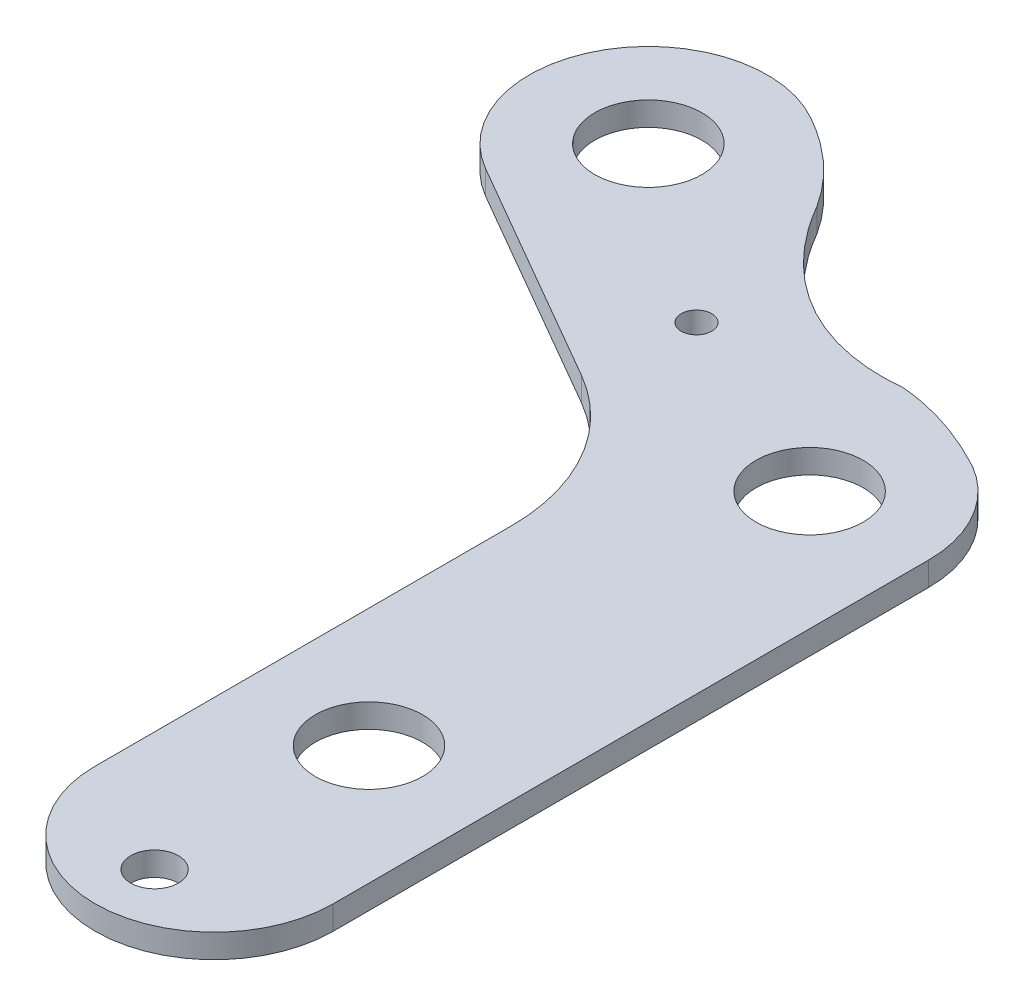
ISO-10303-21;
HEADER;
FILE_DESCRIPTION(('STEP AP214'),'2;1');
FILE_NAME('part.step','',(''),(''),'','','');
FILE_SCHEMA(('AUTOMOTIVE_DESIGN { 1 0 10303 214 1 1 1 1 }'));
ENDSEC;
DATA;
#1=APPLICATION_CONTEXT('core data for automotive mechanical design processes');
#2=APPLICATION_PROTOCOL_DEFINITION('international standard','automotive_design',2000,#1);
#3=PRODUCT_CONTEXT('',#1,'mechanical');
#4=PRODUCT('Part','Part','',(#3));
#5=PRODUCT_RELATED_PRODUCT_CATEGORY('part','',(#4));
#6=PRODUCT_DEFINITION_FORMATION('','',#4);
#7=PRODUCT_DEFINITION_CONTEXT('part definition',#1,'design');
#8=PRODUCT_DEFINITION('design','',#6,#7);
#9=PRODUCT_DEFINITION_SHAPE('','',#8);
#10=(LENGTH_UNIT() NAMED_UNIT(*) SI_UNIT(.MILLI.,.METRE.));
#11=(NAMED_UNIT(*) PLANE_ANGLE_UNIT() SI_UNIT($,.RADIAN.));
#12=(NAMED_UNIT(*) SI_UNIT($,.STERADIAN.) SOLID_ANGLE_UNIT());
#13=UNCERTAINTY_MEASURE_WITH_UNIT(LENGTH_MEASURE(1.E-05),#10,'distance_accuracy_value','');
#14=(GEOMETRIC_REPRESENTATION_CONTEXT(3) GLOBAL_UNCERTAINTY_ASSIGNED_CONTEXT((#13)) GLOBAL_UNIT_ASSIGNED_CONTEXT((#10,
#11,#12)) REPRESENTATION_CONTEXT('',''));
#15=CARTESIAN_POINT('',(0.,0.,0.));
#16=DIRECTION('',(0.,0.,1.));
#17=DIRECTION('',(1.,0.,0.));
#18=AXIS2_PLACEMENT_3D('',#15,#16,#17);
#19=CARTESIAN_POINT('',(-101.736334309577,6.35,-176.2125));
#20=DIRECTION('',(0.,-1.,0.));
#21=DIRECTION('',(0.,0.,-1.));
#22=AXIS2_PLACEMENT_3D('',#19,#20,#21);
#23=PLANE('',#22);
#24=CARTESIAN_POINT('',(-101.736334309577,6.35,-176.2125));
#25=DIRECTION('',(0.,1.,0.));
#26=DIRECTION('',(0.,0.,-1.));
#27=AXIS2_PLACEMENT_3D('',#24,#25,#26);
#28=CIRCLE('',#27,31.7499999999993);
#29=CARTESIAN_POINT('',(-85.8613343095773,6.35,-203.708806570155));
#30=VERTEX_POINT('',#29);
#31=CARTESIAN_POINT('',(-117.611334309577,6.35,-148.716193429845));
#32=VERTEX_POINT('',#31);
#33=EDGE_CURVE('E273',#30,#32,#28,.T.);
#34=ORIENTED_EDGE('',*,*,#33,.T.);
#35=DIRECTION('',(0.866025403784439,0.,0.5));
#36=VECTOR('',#35,1.);
#37=CARTESIAN_POINT('',(-57.1500000000007,6.35,-113.808825790647));
#38=LINE('',#37,#36);
#39=CARTESIAN_POINT('',(-57.1500000000007,6.35,-113.808825790647));
#40=VERTEX_POINT('',#39);
#41=EDGE_CURVE('E106',#32,#40,#38,.T.);
#42=ORIENTED_EDGE('',*,*,#41,.T.);
#43=CARTESIAN_POINT('',(-82.5500000000007,6.35,-69.8147352783976));
#44=DIRECTION('',(0.,-1.,0.));
#45=DIRECTION('',(0.,0.,1.));
#46=AXIS2_PLACEMENT_3D('',#43,#44,#45);
#47=CIRCLE('',#46,50.8);
#48=CARTESIAN_POINT('',(-31.7500000000007,6.35,-69.8147352783976));
#49=VERTEX_POINT('',#48);
#50=EDGE_CURVE('E278',#40,#49,#47,.T.);
#51=ORIENTED_EDGE('',*,*,#50,.T.);
#52=DIRECTION('',(0.,0.,1.));
#53=VECTOR('',#52,1.);
#54=CARTESIAN_POINT('',(-31.7500000000007,6.35,41.275));
#55=LINE('',#54,#53);
#56=CARTESIAN_POINT('',(-31.7500000000007,6.35,41.275));
#57=VERTEX_POINT('',#56);
#58=EDGE_CURVE('E281',#49,#57,#55,.T.);
#59=ORIENTED_EDGE('',*,*,#58,.T.);
#60=CARTESIAN_POINT('',(-7.04062969087805E-13,6.35,41.275));
#61=DIRECTION('',(0.,1.,0.));
#62=DIRECTION('',(0.,0.,-1.));
#63=AXIS2_PLACEMENT_3D('',#60,#61,#62);
#64=CIRCLE('',#63,31.75);
#65=CARTESIAN_POINT('',(31.7499999999993,6.35,41.275));
#66=VERTEX_POINT('',#65);
#67=EDGE_CURVE('E284',#57,#66,#64,.T.);
#68=ORIENTED_EDGE('',*,*,#67,.T.);
#69=DIRECTION('',(0.,0.,-1.));
#70=VECTOR('',#69,1.);
#71=CARTESIAN_POINT('',(31.7499999999993,6.35,-20.0319719528374));
#72=LINE('',#71,#70);
#73=CARTESIAN_POINT('',(31.7499999999993,6.35,-117.475));
#74=VERTEX_POINT('',#73);
#75=EDGE_CURVE('E287',#66,#74,#72,.T.);
#76=ORIENTED_EDGE('',*,*,#75,.T.);
#77=CARTESIAN_POINT('',(0.,6.35,-117.475));
#78=DIRECTION('',(0.,1.,0.));
#79=DIRECTION('',(0.,0.,1.));
#80=AXIS2_PLACEMENT_3D('',#77,#78,#79);
#81=CIRCLE('',#80,31.7499999999993);
#82=CARTESIAN_POINT('',(15.8749999999996,6.35,-144.971306570155));
#83=VERTEX_POINT('',#82);
#84=EDGE_CURVE('E131',#74,#83,#81,.T.);
#85=ORIENTED_EDGE('',*,*,#84,.T.);
#86=CARTESIAN_POINT('',(15.8749999999996,6.35,-144.971306570155));
#87=CARTESIAN_POINT('',(1.22445048235459,6.35,-152.855976046516));
#88=CARTESIAN_POINT('',(-11.4263853245988,6.35,-153.835795689486));
#89=B_SPLINE_CURVE_WITH_KNOTS('',2,(#86,#87,#88),.UNSPECIFIED.,.F.,.F.,(3,3),(0.,1.),.UNSPECIFIED.);
#90=CARTESIAN_POINT('',(-11.4263853245988,6.35,-153.835795689486));
#91=VERTEX_POINT('',#90);
#92=EDGE_CURVE('E125',#83,#91,#89,.T.);
#93=ORIENTED_EDGE('',*,*,#92,.T.);
#94=CARTESIAN_POINT('',(-11.4263853245988,6.35,-153.835795689486));
#95=CARTESIAN_POINT('',(-33.1836717397412,6.35,-151.627706726659));
#96=CARTESIAN_POINT('',(-52.4235071210076,6.35,-162.771572898098));
#97=CARTESIAN_POINT('',(-64.7835066551173,6.35,-184.207168681212));
#98=B_SPLINE_CURVE_WITH_KNOTS('',3,(#94,#95,#96,#97),.UNSPECIFIED.,.F.,.F.,(4,4),(0.,1.),.UNSPECIFIED.);
#99=CARTESIAN_POINT('',(-64.7835066551173,6.35,-184.207168681212));
#100=VERTEX_POINT('',#99);
#101=EDGE_CURVE('E129',#91,#100,#98,.T.);
#102=ORIENTED_EDGE('',*,*,#101,.T.);
#103=CARTESIAN_POINT('',(-64.7835066551173,6.35,-184.207168681212));
#104=CARTESIAN_POINT('',(-72.3862869621943,6.35,-196.104383794496));
#105=CARTESIAN_POINT('',(-85.8613343095773,6.35,-203.708806570155));
#106=B_SPLINE_CURVE_WITH_KNOTS('',2,(#103,#104,#105),.UNSPECIFIED.,.F.,.F.,(3,3),(0.,1.),.UNSPECIFIED.);
#107=EDGE_CURVE('E57',#100,#30,#106,.T.);
#108=ORIENTED_EDGE('',*,*,#107,.T.);
#109=EDGE_LOOP('',(#34,#42,#51,#59,#68,#76,#85,#93,#102,#108));
#110=FACE_BOUND('',#109,.T.);
#111=CARTESIAN_POINT('',(-54.0431671547885,6.35,-141.344488685969));
#112=DIRECTION('',(0.,1.,0.));
#113=DIRECTION('',(0.,0.,1.));
#114=AXIS2_PLACEMENT_3D('',#111,#112,#113);
#115=CIRCLE('',#114,4.06400000000001);
#116=CARTESIAN_POINT('',(-54.0431671547885,6.35,-137.280488685969));
#117=VERTEX_POINT('',#116);
#118=EDGE_CURVE('E265',#117,#117,#115,.T.);
#119=ORIENTED_EDGE('',*,*,#118,.F.);
#120=EDGE_LOOP('',(#119));
#121=FACE_BOUND('',#120,.T.);
#122=CARTESIAN_POINT('',(0.,6.35,0.));
#123=DIRECTION('',(0.,1.,0.));
#124=DIRECTION('',(0.,0.,1.));
#125=AXIS2_PLACEMENT_3D('',#122,#123,#124);
#126=CIRCLE('',#125,14.2875);
#127=CARTESIAN_POINT('',(0.,6.35,14.2875));
#128=VERTEX_POINT('',#127);
#129=EDGE_CURVE('E257',#128,#128,#126,.T.);
#130=ORIENTED_EDGE('',*,*,#129,.F.);
#131=EDGE_LOOP('',(#130));
#132=FACE_BOUND('',#131,.T.);
#133=CARTESIAN_POINT('',(0.,6.35,-117.475));
#134=DIRECTION('',(0.,1.,0.));
#135=DIRECTION('',(0.,0.,1.));
#136=AXIS2_PLACEMENT_3D('',#133,#134,#135);
#137=CIRCLE('',#136,14.2875);
#138=CARTESIAN_POINT('',(0.,6.35,-103.1875));
#139=VERTEX_POINT('',#138);
#140=EDGE_CURVE('E249',#139,#139,#137,.T.);
#141=ORIENTED_EDGE('',*,*,#140,.F.);
#142=EDGE_LOOP('',(#141));
#143=FACE_BOUND('',#142,.T.);
#144=CARTESIAN_POINT('',(-101.736334309577,6.35,-176.2125));
#145=DIRECTION('',(0.,1.,0.));
#146=DIRECTION('',(0.,0.,1.));
#147=AXIS2_PLACEMENT_3D('',#144,#145,#146);
#148=CIRCLE('',#147,14.2874999999995);
#149=CARTESIAN_POINT('',(-101.736334309577,6.35,-161.925));
#150=VERTEX_POINT('',#149);
#151=EDGE_CURVE('E241',#150,#150,#148,.T.);
#152=ORIENTED_EDGE('',*,*,#151,.F.);
#153=EDGE_LOOP('',(#152));
#154=FACE_BOUND('',#153,.T.);
#155=CARTESIAN_POINT('',(0.,6.35,57.15));
#156=DIRECTION('',(0.,1.,0.));
#157=DIRECTION('',(0.,0.,1.));
#158=AXIS2_PLACEMENT_3D('',#155,#156,#157);
#159=CIRCLE('',#158,6.35);
#160=CARTESIAN_POINT('',(0.,6.35,63.5));
#161=VERTEX_POINT('',#160);
#162=EDGE_CURVE('E230',#161,#161,#159,.T.);
#163=ORIENTED_EDGE('',*,*,#162,.F.);
#164=EDGE_LOOP('',(#163));
#165=FACE_BOUND('',#164,.T.);
#166=ADVANCED_FACE('F39',(#110,#121,#132,#143,#154,#165),#23,.F.);
#167=CARTESIAN_POINT('',(-101.736334309577,0.,-176.2125));
#168=DIRECTION('',(0.,-1.,0.));
#169=DIRECTION('',(0.,0.,-1.));
#170=AXIS2_PLACEMENT_3D('',#167,#168,#169);
#171=PLANE('',#170);
#172=CARTESIAN_POINT('',(-101.736334309577,0.,-176.2125));
#173=DIRECTION('',(0.,1.,0.));
#174=DIRECTION('',(0.,0.,1.));
#175=AXIS2_PLACEMENT_3D('',#172,#173,#174);
#176=CIRCLE('',#175,14.2874999999995);
#177=CARTESIAN_POINT('',(-101.736334309577,0.,-161.925));
#178=VERTEX_POINT('',#177);
#179=EDGE_CURVE('E238',#178,#178,#176,.T.);
#180=ORIENTED_EDGE('',*,*,#179,.T.);
#181=EDGE_LOOP('',(#180));
#182=FACE_BOUND('',#181,.T.);
#183=CARTESIAN_POINT('',(0.,0.,0.));
#184=DIRECTION('',(0.,1.,0.));
#185=DIRECTION('',(0.,0.,1.));
#186=AXIS2_PLACEMENT_3D('',#183,#184,#185);
#187=CIRCLE('',#186,14.2875);
#188=CARTESIAN_POINT('',(0.,0.,14.2875));
#189=VERTEX_POINT('',#188);
#190=EDGE_CURVE('E253',#189,#189,#187,.T.);
#191=ORIENTED_EDGE('',*,*,#190,.T.);
#192=EDGE_LOOP('',(#191));
#193=FACE_BOUND('',#192,.T.);
#194=CARTESIAN_POINT('',(-101.736334309577,0.,-176.2125));
#195=DIRECTION('',(0.,1.,0.));
#196=DIRECTION('',(0.,0.,-1.));
#197=AXIS2_PLACEMENT_3D('',#194,#195,#196);
#198=CIRCLE('',#197,31.7499999999993);
#199=CARTESIAN_POINT('',(-85.8613343095773,0.,-203.708806570155));
#200=VERTEX_POINT('',#199);
#201=CARTESIAN_POINT('',(-117.611334309577,0.,-148.716193429845));
#202=VERTEX_POINT('',#201);
#203=EDGE_CURVE('E269',#200,#202,#198,.T.);
#204=ORIENTED_EDGE('',*,*,#203,.F.);
#205=CARTESIAN_POINT('',(-64.7835066551173,0.,-184.207168681212));
#206=CARTESIAN_POINT('',(-72.3862869621943,0.,-196.104383794496));
#207=CARTESIAN_POINT('',(-85.8613343095773,0.,-203.708806570155));
#208=B_SPLINE_CURVE_WITH_KNOTS('',2,(#205,#206,#207),.UNSPECIFIED.,.F.,.F.,(3,3),(0.,1.),.UNSPECIFIED.);
#209=CARTESIAN_POINT('',(-64.7835066551173,0.,-184.207168681212));
#210=VERTEX_POINT('',#209);
#211=EDGE_CURVE('E98',#210,#200,#208,.T.);
#212=ORIENTED_EDGE('',*,*,#211,.F.);
#213=CARTESIAN_POINT('',(-11.4263853245988,0.,-153.835795689486));
#214=CARTESIAN_POINT('',(-33.1836717397412,0.,-151.627706726659));
#215=CARTESIAN_POINT('',(-52.4235071210076,0.,-162.771572898098));
#216=CARTESIAN_POINT('',(-64.7835066551173,0.,-184.207168681212));
#217=B_SPLINE_CURVE_WITH_KNOTS('',3,(#213,#214,#215,#216),.UNSPECIFIED.,.F.,.F.,(4,4),(0.,1.),.UNSPECIFIED.);
#218=CARTESIAN_POINT('',(-11.4263853245988,0.,-153.835795689486));
#219=VERTEX_POINT('',#218);
#220=EDGE_CURVE('E92',#219,#210,#217,.T.);
#221=ORIENTED_EDGE('',*,*,#220,.F.);
#222=CARTESIAN_POINT('',(15.8749999999996,0.,-144.971306570155));
#223=CARTESIAN_POINT('',(1.22445048235459,0.,-152.855976046516));
#224=CARTESIAN_POINT('',(-11.4263853245988,0.,-153.835795689486));
#225=B_SPLINE_CURVE_WITH_KNOTS('',2,(#222,#223,#224),.UNSPECIFIED.,.F.,.F.,(3,3),(0.,1.),.UNSPECIFIED.);
#226=CARTESIAN_POINT('',(15.8749999999996,0.,-144.971306570155));
#227=VERTEX_POINT('',#226);
#228=EDGE_CURVE('E140',#227,#219,#225,.T.);
#229=ORIENTED_EDGE('',*,*,#228,.F.);
#230=CARTESIAN_POINT('',(0.,0.,-117.475));
#231=DIRECTION('',(0.,1.,0.));
#232=DIRECTION('',(0.,0.,1.));
#233=AXIS2_PLACEMENT_3D('',#230,#231,#232);
#234=CIRCLE('',#233,31.7499999999993);
#235=CARTESIAN_POINT('',(31.7499999999993,0.,-117.475));
#236=VERTEX_POINT('',#235);
#237=EDGE_CURVE('E296',#236,#227,#234,.T.);
#238=ORIENTED_EDGE('',*,*,#237,.F.);
#239=DIRECTION('',(0.,0.,-1.));
#240=VECTOR('',#239,1.);
#241=CARTESIAN_POINT('',(31.7499999999993,0.,-20.0319719528374));
#242=LINE('',#241,#240);
#243=CARTESIAN_POINT('',(31.7499999999993,0.,41.275));
#244=VERTEX_POINT('',#243);
#245=EDGE_CURVE('E299',#244,#236,#242,.T.);
#246=ORIENTED_EDGE('',*,*,#245,.F.);
#247=CARTESIAN_POINT('',(-7.04062969087805E-13,0.,41.275));
#248=DIRECTION('',(0.,1.,0.));
#249=DIRECTION('',(0.,0.,-1.));
#250=AXIS2_PLACEMENT_3D('',#247,#248,#249);
#251=CIRCLE('',#250,31.75);
#252=CARTESIAN_POINT('',(-31.7500000000007,0.,41.275));
#253=VERTEX_POINT('',#252);
#254=EDGE_CURVE('E302',#253,#244,#251,.T.);
#255=ORIENTED_EDGE('',*,*,#254,.F.);
#256=DIRECTION('',(0.,0.,1.));
#257=VECTOR('',#256,1.);
#258=CARTESIAN_POINT('',(-31.7500000000007,0.,41.275));
#259=LINE('',#258,#257);
#260=CARTESIAN_POINT('',(-31.7500000000007,0.,-69.8147352783976));
#261=VERTEX_POINT('',#260);
#262=EDGE_CURVE('E306',#261,#253,#259,.T.);
#263=ORIENTED_EDGE('',*,*,#262,.F.);
#264=CARTESIAN_POINT('',(-82.5500000000007,0.,-69.8147352783976));
#265=DIRECTION('',(0.,-1.,0.));
#266=DIRECTION('',(0.,0.,1.));
#267=AXIS2_PLACEMENT_3D('',#264,#265,#266);
#268=CIRCLE('',#267,50.8);
#269=CARTESIAN_POINT('',(-57.1500000000007,0.,-113.808825790647));
#270=VERTEX_POINT('',#269);
#271=EDGE_CURVE('E309',#270,#261,#268,.T.);
#272=ORIENTED_EDGE('',*,*,#271,.F.);
#273=DIRECTION('',(0.866025403784439,0.,0.5));
#274=VECTOR('',#273,1.);
#275=CARTESIAN_POINT('',(-57.1500000000007,0.,-113.808825790647));
#276=LINE('',#275,#274);
#277=EDGE_CURVE('E312',#202,#270,#276,.T.);
#278=ORIENTED_EDGE('',*,*,#277,.F.);
#279=EDGE_LOOP('',(#204,#212,#221,#229,#238,#246,#255,#263,#272,#278));
#280=FACE_BOUND('',#279,.T.);
#281=CARTESIAN_POINT('',(-54.0431671547885,0.,-141.344488685969));
#282=DIRECTION('',(0.,1.,0.));
#283=DIRECTION('',(0.,0.,1.));
#284=AXIS2_PLACEMENT_3D('',#281,#282,#283);
#285=CIRCLE('',#284,4.06400000000001);
#286=CARTESIAN_POINT('',(-54.0431671547885,0.,-137.280488685969));
#287=VERTEX_POINT('',#286);
#288=EDGE_CURVE('E261',#287,#287,#285,.T.);
#289=ORIENTED_EDGE('',*,*,#288,.T.);
#290=EDGE_LOOP('',(#289));
#291=FACE_BOUND('',#290,.T.);
#292=CARTESIAN_POINT('',(0.,0.,-117.475));
#293=DIRECTION('',(0.,1.,0.));
#294=DIRECTION('',(0.,0.,1.));
#295=AXIS2_PLACEMENT_3D('',#292,#293,#294);
#296=CIRCLE('',#295,14.2875);
#297=CARTESIAN_POINT('',(0.,0.,-103.1875));
#298=VERTEX_POINT('',#297);
#299=EDGE_CURVE('E245',#298,#298,#296,.T.);
#300=ORIENTED_EDGE('',*,*,#299,.T.);
#301=EDGE_LOOP('',(#300));
#302=FACE_BOUND('',#301,.T.);
#303=CARTESIAN_POINT('',(0.,0.,57.15));
#304=DIRECTION('',(0.,1.,0.));
#305=DIRECTION('',(0.,0.,1.));
#306=AXIS2_PLACEMENT_3D('',#303,#304,#305);
#307=CIRCLE('',#306,6.35);
#308=CARTESIAN_POINT('',(0.,0.,63.5));
#309=VERTEX_POINT('',#308);
#310=EDGE_CURVE('E233',#309,#309,#307,.T.);
#311=ORIENTED_EDGE('',*,*,#310,.T.);
#312=EDGE_LOOP('',(#311));
#313=FACE_BOUND('',#312,.T.);
#314=ADVANCED_FACE('F197',(#182,#193,#280,#291,#302,#313),#171,.T.);
#315=CARTESIAN_POINT('',(-101.736334309577,6.35,-176.2125));
#316=DIRECTION('',(0.,-1.,0.));
#317=DIRECTION('',(0.,0.,-1.));
#318=AXIS2_PLACEMENT_3D('',#315,#316,#317);
#319=CYLINDRICAL_SURFACE('',#318,31.7499999999993);
#320=ORIENTED_EDGE('',*,*,#203,.T.);
#321=DIRECTION('',(0.,-1.,0.));
#322=VECTOR('',#321,1.);
#323=CARTESIAN_POINT('',(-117.611334309577,6.35,-148.716193429845));
#324=LINE('',#323,#322);
#325=EDGE_CURVE('E11',#32,#202,#324,.T.);
#326=ORIENTED_EDGE('',*,*,#325,.F.);
#327=ORIENTED_EDGE('',*,*,#33,.F.);
#328=DIRECTION('',(0.,-1.,0.));
#329=VECTOR('',#328,1.);
#330=CARTESIAN_POINT('',(-85.8613343095773,6.35,-203.708806570155));
#331=LINE('',#330,#329);
#332=EDGE_CURVE('E149',#30,#200,#331,.T.);
#333=ORIENTED_EDGE('',*,*,#332,.T.);
#334=EDGE_LOOP('',(#320,#326,#327,#333));
#335=FACE_BOUND('',#334,.T.);
#336=ADVANCED_FACE('F41',(#335),#319,.T.);
#337=CARTESIAN_POINT('',(-57.1500000000007,6.35,-113.808825790647));
#338=DIRECTION('',(0.5,0.,-0.866025403784439));
#339=DIRECTION('',(-0.866025403784439,0.,-0.5));
#340=AXIS2_PLACEMENT_3D('',#337,#338,#339);
#341=PLANE('',#340);
#342=ORIENTED_EDGE('',*,*,#277,.T.);
#343=DIRECTION('',(0.,-1.,0.));
#344=VECTOR('',#343,1.);
#345=CARTESIAN_POINT('',(-57.1500000000007,6.35,-113.808825790647));
#346=LINE('',#345,#344);
#347=EDGE_CURVE('E49',#40,#270,#346,.T.);
#348=ORIENTED_EDGE('',*,*,#347,.F.);
#349=ORIENTED_EDGE('',*,*,#41,.F.);
#350=ORIENTED_EDGE('',*,*,#325,.T.);
#351=EDGE_LOOP('',(#342,#348,#349,#350));
#352=FACE_BOUND('',#351,.T.);
#353=ADVANCED_FACE('F191',(#352),#341,.F.);
#354=CARTESIAN_POINT('',(-82.5500000000007,6.35,-69.8147352783976));
#355=DIRECTION('',(0.,-1.,0.));
#356=DIRECTION('',(0.,0.,-1.));
#357=AXIS2_PLACEMENT_3D('',#354,#355,#356);
#358=CYLINDRICAL_SURFACE('',#357,50.8);
#359=ORIENTED_EDGE('',*,*,#271,.T.);
#360=DIRECTION('',(0.,-1.,0.));
#361=VECTOR('',#360,1.);
#362=CARTESIAN_POINT('',(-31.7500000000007,6.35,-69.8147352783976));
#363=LINE('',#362,#361);
#364=EDGE_CURVE('E353',#49,#261,#363,.T.);
#365=ORIENTED_EDGE('',*,*,#364,.F.);
#366=ORIENTED_EDGE('',*,*,#50,.F.);
#367=ORIENTED_EDGE('',*,*,#347,.T.);
#368=EDGE_LOOP('',(#359,#365,#366,#367));
#369=FACE_BOUND('',#368,.T.);
#370=ADVANCED_FACE('F188',(#369),#358,.F.);
#371=CARTESIAN_POINT('',(-31.7500000000007,6.35,41.275));
#372=DIRECTION('',(1.,0.,0.));
#373=DIRECTION('',(0.,0.,-1.));
#374=AXIS2_PLACEMENT_3D('',#371,#372,#373);
#375=PLANE('',#374);
#376=ORIENTED_EDGE('',*,*,#262,.T.);
#377=DIRECTION('',(0.,-1.,0.));
#378=VECTOR('',#377,1.);
#379=CARTESIAN_POINT('',(-31.7500000000007,6.35,41.275));
#380=LINE('',#379,#378);
#381=EDGE_CURVE('E349',#57,#253,#380,.T.);
#382=ORIENTED_EDGE('',*,*,#381,.F.);
#383=ORIENTED_EDGE('',*,*,#58,.F.);
#384=ORIENTED_EDGE('',*,*,#364,.T.);
#385=EDGE_LOOP('',(#376,#382,#383,#384));
#386=FACE_BOUND('',#385,.T.);
#387=ADVANCED_FACE('F184',(#386),#375,.F.);
#388=CARTESIAN_POINT('',(-7.04062969087805E-13,6.35,41.275));
#389=DIRECTION('',(0.,-1.,0.));
#390=DIRECTION('',(0.,0.,-1.));
#391=AXIS2_PLACEMENT_3D('',#388,#389,#390);
#392=CYLINDRICAL_SURFACE('',#391,31.75);
#393=ORIENTED_EDGE('',*,*,#254,.T.);
#394=DIRECTION('',(0.,-1.,0.));
#395=VECTOR('',#394,1.);
#396=CARTESIAN_POINT('',(31.7499999999993,6.35,41.275));
#397=LINE('',#396,#395);
#398=EDGE_CURVE('E345',#66,#244,#397,.T.);
#399=ORIENTED_EDGE('',*,*,#398,.F.);
#400=ORIENTED_EDGE('',*,*,#67,.F.);
#401=ORIENTED_EDGE('',*,*,#381,.T.);
#402=EDGE_LOOP('',(#393,#399,#400,#401));
#403=FACE_BOUND('',#402,.T.);
#404=ADVANCED_FACE('F180',(#403),#392,.T.);
#405=CARTESIAN_POINT('',(31.7499999999993,6.35,-20.0319719528374));
#406=DIRECTION('',(-1.,0.,0.));
#407=DIRECTION('',(0.,0.,1.));
#408=AXIS2_PLACEMENT_3D('',#405,#406,#407);
#409=PLANE('',#408);
#410=ORIENTED_EDGE('',*,*,#245,.T.);
#411=DIRECTION('',(0.,-1.,0.));
#412=VECTOR('',#411,1.);
#413=CARTESIAN_POINT('',(31.7499999999993,6.35,-117.475));
#414=LINE('',#413,#412);
#415=EDGE_CURVE('E341',#74,#236,#414,.T.);
#416=ORIENTED_EDGE('',*,*,#415,.F.);
#417=ORIENTED_EDGE('',*,*,#75,.F.);
#418=ORIENTED_EDGE('',*,*,#398,.T.);
#419=EDGE_LOOP('',(#410,#416,#417,#418));
#420=FACE_BOUND('',#419,.T.);
#421=ADVANCED_FACE('F176',(#420),#409,.F.);
#422=CARTESIAN_POINT('',(0.,6.35,-117.475));
#423=DIRECTION('',(0.,-1.,0.));
#424=DIRECTION('',(0.,0.,-1.));
#425=AXIS2_PLACEMENT_3D('',#422,#423,#424);
#426=CYLINDRICAL_SURFACE('',#425,31.7499999999993);
#427=ORIENTED_EDGE('',*,*,#237,.T.);
#428=DIRECTION('',(0.,-1.,0.));
#429=VECTOR('',#428,1.);
#430=CARTESIAN_POINT('',(15.8749999999996,6.35,-144.971306570155));
#431=LINE('',#430,#429);
#432=EDGE_CURVE('E142',#83,#227,#431,.T.);
#433=ORIENTED_EDGE('',*,*,#432,.F.);
#434=ORIENTED_EDGE('',*,*,#84,.F.);
#435=ORIENTED_EDGE('',*,*,#415,.T.);
#436=EDGE_LOOP('',(#427,#433,#434,#435));
#437=FACE_BOUND('',#436,.T.);
#438=ADVANCED_FACE('F173',(#437),#426,.T.);
#439=DIRECTION('',(0.,-1.,0.));
#440=VECTOR('',#439,1.);
#441=SURFACE_OF_LINEAR_EXTRUSION('',#89,#440);
#442=ORIENTED_EDGE('',*,*,#228,.T.);
#443=DIRECTION('',(0.,-1.,0.));
#444=VECTOR('',#443,1.);
#445=CARTESIAN_POINT('',(-11.4263853245988,6.35,-153.835795689486));
#446=LINE('',#445,#444);
#447=EDGE_CURVE('E137',#91,#219,#446,.T.);
#448=ORIENTED_EDGE('',*,*,#447,.F.);
#449=ORIENTED_EDGE('',*,*,#92,.F.);
#450=ORIENTED_EDGE('',*,*,#432,.T.);
#451=EDGE_LOOP('',(#442,#448,#449,#450));
#452=FACE_BOUND('',#451,.T.);
#453=ADVANCED_FACE('F138',(#452),#441,.F.);
#454=DIRECTION('',(0.,-1.,0.));
#455=VECTOR('',#454,1.);
#456=SURFACE_OF_LINEAR_EXTRUSION('',#98,#455);
#457=ORIENTED_EDGE('',*,*,#220,.T.);
#458=DIRECTION('',(0.,-1.,0.));
#459=VECTOR('',#458,1.);
#460=CARTESIAN_POINT('',(-64.7835066551173,6.35,-184.207168681212));
#461=LINE('',#460,#459);
#462=EDGE_CURVE('E143',#100,#210,#461,.T.);
#463=ORIENTED_EDGE('',*,*,#462,.F.);
#464=ORIENTED_EDGE('',*,*,#101,.F.);
#465=ORIENTED_EDGE('',*,*,#447,.T.);
#466=EDGE_LOOP('',(#457,#463,#464,#465));
#467=FACE_BOUND('',#466,.T.);
#468=ADVANCED_FACE('F145',(#467),#456,.F.);
#469=DIRECTION('',(0.,-1.,0.));
#470=VECTOR('',#469,1.);
#471=SURFACE_OF_LINEAR_EXTRUSION('',#106,#470);
#472=ORIENTED_EDGE('',*,*,#211,.T.);
#473=ORIENTED_EDGE('',*,*,#332,.F.);
#474=ORIENTED_EDGE('',*,*,#107,.F.);
#475=ORIENTED_EDGE('',*,*,#462,.T.);
#476=EDGE_LOOP('',(#472,#473,#474,#475));
#477=FACE_BOUND('',#476,.T.);
#478=ADVANCED_FACE('F169',(#477),#471,.F.);
#479=CARTESIAN_POINT('',(-54.0431671547885,6.35,-141.344488685969));
#480=DIRECTION('',(0.,-1.,0.));
#481=DIRECTION('',(0.,0.,-1.));
#482=AXIS2_PLACEMENT_3D('',#479,#480,#481);
#483=CYLINDRICAL_SURFACE('',#482,4.06400000000001);
#484=ORIENTED_EDGE('',*,*,#118,.T.);
#485=EDGE_LOOP('',(#484));
#486=FACE_BOUND('',#485,.T.);
#487=ORIENTED_EDGE('',*,*,#288,.F.);
#488=EDGE_LOOP('',(#487));
#489=FACE_BOUND('',#488,.T.);
#490=ADVANCED_FACE('F206',(#486,#489),#483,.F.);
#491=CARTESIAN_POINT('',(0.,6.35,0.));
#492=DIRECTION('',(0.,-1.,0.));
#493=DIRECTION('',(0.,0.,-1.));
#494=AXIS2_PLACEMENT_3D('',#491,#492,#493);
#495=CYLINDRICAL_SURFACE('',#494,14.2875);
#496=ORIENTED_EDGE('',*,*,#129,.T.);
#497=EDGE_LOOP('',(#496));
#498=FACE_BOUND('',#497,.T.);
#499=ORIENTED_EDGE('',*,*,#190,.F.);
#500=EDGE_LOOP('',(#499));
#501=FACE_BOUND('',#500,.T.);
#502=ADVANCED_FACE('F209',(#498,#501),#495,.F.);
#503=CARTESIAN_POINT('',(0.,6.35,-117.475));
#504=DIRECTION('',(0.,-1.,0.));
#505=DIRECTION('',(0.,0.,-1.));
#506=AXIS2_PLACEMENT_3D('',#503,#504,#505);
#507=CYLINDRICAL_SURFACE('',#506,14.2875);
#508=ORIENTED_EDGE('',*,*,#140,.T.);
#509=EDGE_LOOP('',(#508));
#510=FACE_BOUND('',#509,.T.);
#511=ORIENTED_EDGE('',*,*,#299,.F.);
#512=EDGE_LOOP('',(#511));
#513=FACE_BOUND('',#512,.T.);
#514=ADVANCED_FACE('F213',(#510,#513),#507,.F.);
#515=CARTESIAN_POINT('',(-101.736334309577,6.35,-176.2125));
#516=DIRECTION('',(0.,-1.,0.));
#517=DIRECTION('',(0.,0.,-1.));
#518=AXIS2_PLACEMENT_3D('',#515,#516,#517);
#519=CYLINDRICAL_SURFACE('',#518,14.2874999999995);
#520=ORIENTED_EDGE('',*,*,#151,.T.);
#521=EDGE_LOOP('',(#520));
#522=FACE_BOUND('',#521,.T.);
#523=ORIENTED_EDGE('',*,*,#179,.F.);
#524=EDGE_LOOP('',(#523));
#525=FACE_BOUND('',#524,.T.);
#526=ADVANCED_FACE('F217',(#522,#525),#519,.F.);
#527=CARTESIAN_POINT('',(0.,6.35,57.15));
#528=DIRECTION('',(0.,-1.,0.));
#529=DIRECTION('',(0.,0.,-1.));
#530=AXIS2_PLACEMENT_3D('',#527,#528,#529);
#531=CYLINDRICAL_SURFACE('',#530,6.35);
#532=ORIENTED_EDGE('',*,*,#162,.T.);
#533=EDGE_LOOP('',(#532));
#534=FACE_BOUND('',#533,.T.);
#535=ORIENTED_EDGE('',*,*,#310,.F.);
#536=EDGE_LOOP('',(#535));
#537=FACE_BOUND('',#536,.T.);
#538=ADVANCED_FACE('F221',(#534,#537),#531,.F.);
#539=CLOSED_SHELL('',(#166,#314,#336,#353,#370,#387,#404,#421,#438,#453,#468,#478,#490,#502,
#514,#526,#538));
#540=MANIFOLD_SOLID_BREP('B2',#539);
#541=ADVANCED_BREP_SHAPE_REPRESENTATION('',(#18,#540),#14);
#542=SHAPE_DEFINITION_REPRESENTATION(#9,#541);
ENDSEC;
END-ISO-10303-21;
